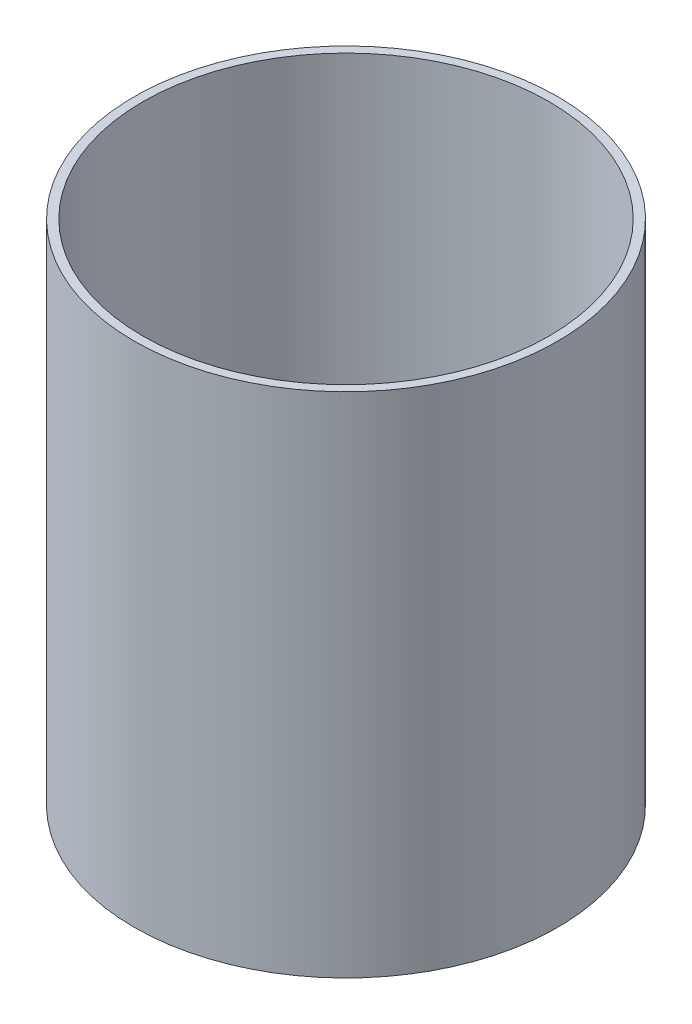
ISO-10303-21;
HEADER;
FILE_DESCRIPTION(('STEP AP214'),'2;1');
FILE_NAME('part.step','',(''),(''),'','','');
FILE_SCHEMA(('AUTOMOTIVE_DESIGN { 1 0 10303 214 1 1 1 1 }'));
ENDSEC;
DATA;
#1=APPLICATION_CONTEXT('core data for automotive mechanical design processes');
#2=APPLICATION_PROTOCOL_DEFINITION('international standard','automotive_design',2000,#1);
#3=PRODUCT_CONTEXT('',#1,'mechanical');
#4=PRODUCT('Part','Part','',(#3));
#5=PRODUCT_RELATED_PRODUCT_CATEGORY('part','',(#4));
#6=PRODUCT_DEFINITION_FORMATION('','',#4);
#7=PRODUCT_DEFINITION_CONTEXT('part definition',#1,'design');
#8=PRODUCT_DEFINITION('design','',#6,#7);
#9=PRODUCT_DEFINITION_SHAPE('','',#8);
#10=(LENGTH_UNIT() NAMED_UNIT(*) SI_UNIT(.MILLI.,.METRE.));
#11=(NAMED_UNIT(*) PLANE_ANGLE_UNIT() SI_UNIT($,.RADIAN.));
#12=(NAMED_UNIT(*) SI_UNIT($,.STERADIAN.) SOLID_ANGLE_UNIT());
#13=UNCERTAINTY_MEASURE_WITH_UNIT(LENGTH_MEASURE(1.E-05),#10,'distance_accuracy_value','');
#14=(GEOMETRIC_REPRESENTATION_CONTEXT(3) GLOBAL_UNCERTAINTY_ASSIGNED_CONTEXT((#13)) GLOBAL_UNIT_ASSIGNED_CONTEXT((#10,
#11,#12)) REPRESENTATION_CONTEXT('',''));
#15=CARTESIAN_POINT('',(0.,0.,0.));
#16=DIRECTION('',(0.,0.,1.));
#17=DIRECTION('',(1.,0.,0.));
#18=AXIS2_PLACEMENT_3D('',#15,#16,#17);
#19=CARTESIAN_POINT('',(-29.3915702540631,58.5,-2.61136815391197));
#20=DIRECTION('',(0.,1.,0.));
#21=DIRECTION('',(0.,0.,1.));
#22=AXIS2_PLACEMENT_3D('',#19,#20,#21);
#23=PLANE('',#22);
#24=CARTESIAN_POINT('',(-29.3915702540631,58.5,-2.61136815391197));
#25=DIRECTION('',(0.,1.,0.));
#26=DIRECTION('',(0.,0.,1.));
#27=AXIS2_PLACEMENT_3D('',#24,#25,#26);
#28=CIRCLE('',#27,24.401);
#29=CARTESIAN_POINT('',(-29.3915702540631,58.5,-27.012368153912));
#30=VERTEX_POINT('',#29);
#31=EDGE_CURVE('E10',#30,#30,#28,.T.);
#32=ORIENTED_EDGE('',*,*,#31,.T.);
#33=EDGE_LOOP('',(#32));
#34=FACE_BOUND('',#33,.T.);
#35=CARTESIAN_POINT('',(-29.3915702540631,58.5,-2.61136815391197));
#36=DIRECTION('',(0.,1.,0.));
#37=DIRECTION('',(0.,0.,1.));
#38=AXIS2_PLACEMENT_3D('',#35,#36,#37);
#39=CIRCLE('',#38,23.401);
#40=CARTESIAN_POINT('',(-29.3915702540631,58.5,-26.012368153912));
#41=VERTEX_POINT('',#40);
#42=EDGE_CURVE('E46',#41,#41,#39,.T.);
#43=ORIENTED_EDGE('',*,*,#42,.F.);
#44=EDGE_LOOP('',(#43));
#45=FACE_BOUND('',#44,.T.);
#46=ADVANCED_FACE('F35',(#34,#45),#23,.T.);
#47=CARTESIAN_POINT('',(-29.3915702540631,0.,-2.61136815391197));
#48=DIRECTION('',(0.,1.,0.));
#49=DIRECTION('',(0.,0.,1.));
#50=AXIS2_PLACEMENT_3D('',#47,#48,#49);
#51=PLANE('',#50);
#52=CARTESIAN_POINT('',(-29.3915702540631,0.,-2.61136815391197));
#53=DIRECTION('',(0.,1.,0.));
#54=DIRECTION('',(0.,0.,1.));
#55=AXIS2_PLACEMENT_3D('',#52,#53,#54);
#56=CIRCLE('',#55,24.401);
#57=CARTESIAN_POINT('',(-29.3915702540631,0.,-27.012368153912));
#58=VERTEX_POINT('',#57);
#59=EDGE_CURVE('E39',#58,#58,#56,.T.);
#60=ORIENTED_EDGE('',*,*,#59,.F.);
#61=EDGE_LOOP('',(#60));
#62=FACE_BOUND('',#61,.T.);
#63=CARTESIAN_POINT('',(-29.3915702540631,0.,-2.61136815391197));
#64=DIRECTION('',(0.,1.,0.));
#65=DIRECTION('',(0.,0.,1.));
#66=AXIS2_PLACEMENT_3D('',#63,#64,#65);
#67=CIRCLE('',#66,23.401);
#68=CARTESIAN_POINT('',(-29.3915702540631,0.,-26.012368153912));
#69=VERTEX_POINT('',#68);
#70=EDGE_CURVE('E48',#69,#69,#67,.T.);
#71=ORIENTED_EDGE('',*,*,#70,.T.);
#72=EDGE_LOOP('',(#71));
#73=FACE_BOUND('',#72,.T.);
#74=ADVANCED_FACE('F58',(#62,#73),#51,.F.);
#75=CARTESIAN_POINT('',(-29.3915702540631,58.5,-2.61136815391197));
#76=DIRECTION('',(0.,-1.,0.));
#77=DIRECTION('',(0.,0.,-1.));
#78=AXIS2_PLACEMENT_3D('',#75,#76,#77);
#79=CYLINDRICAL_SURFACE('',#78,24.401);
#80=CARTESIAN_POINT('',(-29.3915702540631,58.5,-27.012368153912));
#81=CARTESIAN_POINT('',(-29.3915702540631,57.890625,-27.012368153912));
#82=CARTESIAN_POINT('',(-29.3915702540631,57.28125,-27.012368153912));
#83=CARTESIAN_POINT('',(-29.3915702540631,56.0625,-27.012368153912));
#84=CARTESIAN_POINT('',(-29.3915702540631,55.453125,-27.012368153912));
#85=CARTESIAN_POINT('',(-29.3915702540631,54.234375,-27.012368153912));
#86=CARTESIAN_POINT('',(-29.3915702540631,53.625,-27.012368153912));
#87=CARTESIAN_POINT('',(-29.3915702540631,52.40625,-27.012368153912));
#88=CARTESIAN_POINT('',(-29.3915702540631,51.796875,-27.012368153912));
#89=CARTESIAN_POINT('',(-29.3915702540631,50.578125,-27.012368153912));
#90=CARTESIAN_POINT('',(-29.3915702540631,49.96875,-27.012368153912));
#91=CARTESIAN_POINT('',(-29.3915702540631,48.75,-27.012368153912));
#92=CARTESIAN_POINT('',(-29.3915702540631,48.140625,-27.012368153912));
#93=CARTESIAN_POINT('',(-29.3915702540631,46.921875,-27.012368153912));
#94=CARTESIAN_POINT('',(-29.3915702540631,46.3125,-27.012368153912));
#95=CARTESIAN_POINT('',(-29.3915702540631,45.09375,-27.012368153912));
#96=CARTESIAN_POINT('',(-29.3915702540631,44.484375,-27.012368153912));
#97=CARTESIAN_POINT('',(-29.3915702540631,43.265625,-27.012368153912));
#98=CARTESIAN_POINT('',(-29.3915702540631,42.65625,-27.012368153912));
#99=CARTESIAN_POINT('',(-29.3915702540631,41.4375,-27.012368153912));
#100=CARTESIAN_POINT('',(-29.3915702540631,40.828125,-27.012368153912));
#101=CARTESIAN_POINT('',(-29.3915702540631,39.609375,-27.012368153912));
#102=CARTESIAN_POINT('',(-29.3915702540631,39.,-27.012368153912));
#103=CARTESIAN_POINT('',(-29.3915702540631,37.78125,-27.012368153912));
#104=CARTESIAN_POINT('',(-29.3915702540631,37.171875,-27.012368153912));
#105=CARTESIAN_POINT('',(-29.3915702540631,35.953125,-27.012368153912));
#106=CARTESIAN_POINT('',(-29.3915702540631,35.34375,-27.012368153912));
#107=CARTESIAN_POINT('',(-29.3915702540631,34.125,-27.012368153912));
#108=CARTESIAN_POINT('',(-29.3915702540631,33.515625,-27.012368153912));
#109=CARTESIAN_POINT('',(-29.3915702540631,32.296875,-27.012368153912));
#110=CARTESIAN_POINT('',(-29.3915702540631,31.6875,-27.012368153912));
#111=CARTESIAN_POINT('',(-29.3915702540631,30.46875,-27.012368153912));
#112=CARTESIAN_POINT('',(-29.3915702540631,29.859375,-27.012368153912));
#113=CARTESIAN_POINT('',(-29.3915702540631,28.640625,-27.012368153912));
#114=CARTESIAN_POINT('',(-29.3915702540631,28.03125,-27.012368153912));
#115=CARTESIAN_POINT('',(-29.3915702540631,26.8125,-27.012368153912));
#116=CARTESIAN_POINT('',(-29.3915702540631,26.203125,-27.012368153912));
#117=CARTESIAN_POINT('',(-29.3915702540631,24.984375,-27.012368153912));
#118=CARTESIAN_POINT('',(-29.3915702540631,24.375,-27.012368153912));
#119=CARTESIAN_POINT('',(-29.3915702540631,23.15625,-27.012368153912));
#120=CARTESIAN_POINT('',(-29.3915702540631,22.546875,-27.012368153912));
#121=CARTESIAN_POINT('',(-29.3915702540631,21.328125,-27.012368153912));
#122=CARTESIAN_POINT('',(-29.3915702540631,20.71875,-27.012368153912));
#123=CARTESIAN_POINT('',(-29.3915702540631,19.5,-27.012368153912));
#124=CARTESIAN_POINT('',(-29.3915702540631,18.890625,-27.012368153912));
#125=CARTESIAN_POINT('',(-29.3915702540631,17.671875,-27.012368153912));
#126=CARTESIAN_POINT('',(-29.3915702540631,17.0625,-27.012368153912));
#127=CARTESIAN_POINT('',(-29.3915702540631,15.84375,-27.012368153912));
#128=CARTESIAN_POINT('',(-29.3915702540631,15.234375,-27.012368153912));
#129=CARTESIAN_POINT('',(-29.3915702540631,14.015625,-27.012368153912));
#130=CARTESIAN_POINT('',(-29.3915702540631,13.40625,-27.012368153912));
#131=CARTESIAN_POINT('',(-29.3915702540631,12.1875,-27.012368153912));
#132=CARTESIAN_POINT('',(-29.3915702540631,11.578125,-27.012368153912));
#133=CARTESIAN_POINT('',(-29.3915702540631,10.359375,-27.012368153912));
#134=CARTESIAN_POINT('',(-29.3915702540631,9.74999999999999,-27.012368153912));
#135=CARTESIAN_POINT('',(-29.3915702540631,8.53124999999999,-27.012368153912));
#136=CARTESIAN_POINT('',(-29.3915702540631,7.92187499999999,-27.012368153912));
#137=CARTESIAN_POINT('',(-29.3915702540631,6.70312499999999,-27.012368153912));
#138=CARTESIAN_POINT('',(-29.3915702540631,6.09374999999999,-27.012368153912));
#139=CARTESIAN_POINT('',(-29.3915702540631,4.87499999999999,-27.012368153912));
#140=CARTESIAN_POINT('',(-29.3915702540631,4.26562499999999,-27.012368153912));
#141=CARTESIAN_POINT('',(-29.3915702540631,3.04687499999999,-27.012368153912));
#142=CARTESIAN_POINT('',(-29.3915702540631,2.43749999999999,-27.012368153912));
#143=CARTESIAN_POINT('',(-29.3915702540631,1.21874999999999,-27.012368153912));
#144=CARTESIAN_POINT('',(-29.3915702540631,0.609374999999993,-27.012368153912));
#145=CARTESIAN_POINT('',(-29.3915702540631,0.,-27.012368153912));
#146=B_SPLINE_CURVE_WITH_KNOTS('',3,(#80,#81,#82,#83,#84,#85,#86,#87,#88,#89,#90,#91,#92,#93,
#94,#95,#96,#97,#98,#99,#100,#101,#102,#103,#104,#105,#106,#107,#108,#109,#110,#111,#112,#113,
#114,#115,#116,#117,#118,#119,#120,#121,#122,#123,#124,#125,#126,#127,#128,#129,#130,#131,#132,
#133,#134,#135,#136,#137,#138,#139,#140,#141,#142,#143,#144,#145),.UNSPECIFIED.,.F.,.F.,(4,2,2,
2,2,2,2,2,2,2,2,2,2,2,2,2,2,2,2,2,2,2,2,2,2,2,2,2,2,2,2,2,4),(0.,1.82812499999999,
3.65624999999999,5.48437499999999,7.31249999999999,9.14062499999999,10.96875,12.796875,14.625,
16.453125,18.28125,20.109375,21.9375,23.765625,25.59375,27.421875,29.25,31.078125,32.90625,
34.734375,36.5625,38.390625,40.21875,42.046875,43.875,45.703125,47.53125,49.359375,51.1875,
53.015625,54.84375,56.671875,58.5),.UNSPECIFIED.);
#147=EDGE_CURVE('BSEAM37',#30,#58,#146,.T.);
#148=ORIENTED_EDGE('',*,*,#31,.F.);
#149=ORIENTED_EDGE('',*,*,#59,.T.);
#150=ORIENTED_EDGE('',*,*,#147,.T.);
#151=ORIENTED_EDGE('',*,*,#147,.F.);
#152=EDGE_LOOP('',(#148,#150,#149,#151));
#153=FACE_BOUND('',#152,.T.);
#154=ADVANCED_FACE('F37',(#153),#79,.T.);
#155=CARTESIAN_POINT('',(-29.3915702540631,58.5,-2.61136815391197));
#156=DIRECTION('',(0.,-1.,0.));
#157=DIRECTION('',(0.,0.,-1.));
#158=AXIS2_PLACEMENT_3D('',#155,#156,#157);
#159=CYLINDRICAL_SURFACE('',#158,23.401);
#160=CARTESIAN_POINT('',(-29.3915702540631,58.5,-26.012368153912));
#161=CARTESIAN_POINT('',(-29.3915702540631,57.890625,-26.012368153912));
#162=CARTESIAN_POINT('',(-29.3915702540631,57.28125,-26.012368153912));
#163=CARTESIAN_POINT('',(-29.3915702540631,56.0625,-26.012368153912));
#164=CARTESIAN_POINT('',(-29.3915702540631,55.453125,-26.012368153912));
#165=CARTESIAN_POINT('',(-29.3915702540631,54.234375,-26.012368153912));
#166=CARTESIAN_POINT('',(-29.3915702540631,53.625,-26.012368153912));
#167=CARTESIAN_POINT('',(-29.3915702540631,52.40625,-26.012368153912));
#168=CARTESIAN_POINT('',(-29.3915702540631,51.796875,-26.012368153912));
#169=CARTESIAN_POINT('',(-29.3915702540631,50.578125,-26.012368153912));
#170=CARTESIAN_POINT('',(-29.3915702540631,49.96875,-26.012368153912));
#171=CARTESIAN_POINT('',(-29.3915702540631,48.75,-26.012368153912));
#172=CARTESIAN_POINT('',(-29.3915702540631,48.140625,-26.012368153912));
#173=CARTESIAN_POINT('',(-29.3915702540631,46.921875,-26.012368153912));
#174=CARTESIAN_POINT('',(-29.3915702540631,46.3125,-26.012368153912));
#175=CARTESIAN_POINT('',(-29.3915702540631,45.09375,-26.012368153912));
#176=CARTESIAN_POINT('',(-29.3915702540631,44.484375,-26.012368153912));
#177=CARTESIAN_POINT('',(-29.3915702540631,43.265625,-26.012368153912));
#178=CARTESIAN_POINT('',(-29.3915702540631,42.65625,-26.012368153912));
#179=CARTESIAN_POINT('',(-29.3915702540631,41.4375,-26.012368153912));
#180=CARTESIAN_POINT('',(-29.3915702540631,40.828125,-26.012368153912));
#181=CARTESIAN_POINT('',(-29.3915702540631,39.609375,-26.012368153912));
#182=CARTESIAN_POINT('',(-29.3915702540631,39.,-26.012368153912));
#183=CARTESIAN_POINT('',(-29.3915702540631,37.78125,-26.012368153912));
#184=CARTESIAN_POINT('',(-29.3915702540631,37.171875,-26.012368153912));
#185=CARTESIAN_POINT('',(-29.3915702540631,35.953125,-26.012368153912));
#186=CARTESIAN_POINT('',(-29.3915702540631,35.34375,-26.012368153912));
#187=CARTESIAN_POINT('',(-29.3915702540631,34.125,-26.012368153912));
#188=CARTESIAN_POINT('',(-29.3915702540631,33.515625,-26.012368153912));
#189=CARTESIAN_POINT('',(-29.3915702540631,32.296875,-26.012368153912));
#190=CARTESIAN_POINT('',(-29.3915702540631,31.6875,-26.012368153912));
#191=CARTESIAN_POINT('',(-29.3915702540631,30.46875,-26.012368153912));
#192=CARTESIAN_POINT('',(-29.3915702540631,29.859375,-26.012368153912));
#193=CARTESIAN_POINT('',(-29.3915702540631,28.640625,-26.012368153912));
#194=CARTESIAN_POINT('',(-29.3915702540631,28.03125,-26.012368153912));
#195=CARTESIAN_POINT('',(-29.3915702540631,26.8125,-26.012368153912));
#196=CARTESIAN_POINT('',(-29.3915702540631,26.203125,-26.012368153912));
#197=CARTESIAN_POINT('',(-29.3915702540631,24.984375,-26.012368153912));
#198=CARTESIAN_POINT('',(-29.3915702540631,24.375,-26.012368153912));
#199=CARTESIAN_POINT('',(-29.3915702540631,23.15625,-26.012368153912));
#200=CARTESIAN_POINT('',(-29.3915702540631,22.546875,-26.012368153912));
#201=CARTESIAN_POINT('',(-29.3915702540631,21.328125,-26.012368153912));
#202=CARTESIAN_POINT('',(-29.3915702540631,20.71875,-26.012368153912));
#203=CARTESIAN_POINT('',(-29.3915702540631,19.5,-26.012368153912));
#204=CARTESIAN_POINT('',(-29.3915702540631,18.890625,-26.012368153912));
#205=CARTESIAN_POINT('',(-29.3915702540631,17.671875,-26.012368153912));
#206=CARTESIAN_POINT('',(-29.3915702540631,17.0625,-26.012368153912));
#207=CARTESIAN_POINT('',(-29.3915702540631,15.84375,-26.012368153912));
#208=CARTESIAN_POINT('',(-29.3915702540631,15.234375,-26.012368153912));
#209=CARTESIAN_POINT('',(-29.3915702540631,14.015625,-26.012368153912));
#210=CARTESIAN_POINT('',(-29.3915702540631,13.40625,-26.012368153912));
#211=CARTESIAN_POINT('',(-29.3915702540631,12.1875,-26.012368153912));
#212=CARTESIAN_POINT('',(-29.3915702540631,11.578125,-26.012368153912));
#213=CARTESIAN_POINT('',(-29.3915702540631,10.359375,-26.012368153912));
#214=CARTESIAN_POINT('',(-29.3915702540631,9.74999999999999,-26.012368153912));
#215=CARTESIAN_POINT('',(-29.3915702540631,8.53124999999999,-26.012368153912));
#216=CARTESIAN_POINT('',(-29.3915702540631,7.92187499999999,-26.012368153912));
#217=CARTESIAN_POINT('',(-29.3915702540631,6.70312499999999,-26.012368153912));
#218=CARTESIAN_POINT('',(-29.3915702540631,6.09374999999999,-26.012368153912));
#219=CARTESIAN_POINT('',(-29.3915702540631,4.87499999999999,-26.012368153912));
#220=CARTESIAN_POINT('',(-29.3915702540631,4.26562499999999,-26.012368153912));
#221=CARTESIAN_POINT('',(-29.3915702540631,3.04687499999999,-26.012368153912));
#222=CARTESIAN_POINT('',(-29.3915702540631,2.43749999999999,-26.012368153912));
#223=CARTESIAN_POINT('',(-29.3915702540631,1.21874999999999,-26.012368153912));
#224=CARTESIAN_POINT('',(-29.3915702540631,0.609374999999993,-26.012368153912));
#225=CARTESIAN_POINT('',(-29.3915702540631,0.,-26.012368153912));
#226=B_SPLINE_CURVE_WITH_KNOTS('',3,(#160,#161,#162,#163,#164,#165,#166,#167,#168,#169,#170,
#171,#172,#173,#174,#175,#176,#177,#178,#179,#180,#181,#182,#183,#184,#185,#186,#187,#188,#189,
#190,#191,#192,#193,#194,#195,#196,#197,#198,#199,#200,#201,#202,#203,#204,#205,#206,#207,#208,
#209,#210,#211,#212,#213,#214,#215,#216,#217,#218,#219,#220,#221,#222,#223,#224,#225),
.UNSPECIFIED.,.F.,.F.,(4,2,2,2,2,2,2,2,2,2,2,2,2,2,2,2,2,2,2,2,2,2,2,2,2,2,2,2,2,2,2,2,4),(0.,
1.82812500000001,3.65625000000001,5.48437500000001,7.31250000000001,9.140625,10.96875,12.796875,
14.625,16.453125,18.28125,20.109375,21.9375,23.765625,25.59375,27.421875,29.25,31.078125,
32.90625,34.734375,36.5625,38.390625,40.21875,42.046875,43.875,45.703125,47.53125,49.359375,
51.1875,53.015625,54.84375,56.671875,58.5),.UNSPECIFIED.);
#227=EDGE_CURVE('BSEAM54',#41,#69,#226,.T.);
#228=ORIENTED_EDGE('',*,*,#42,.T.);
#229=ORIENTED_EDGE('',*,*,#70,.F.);
#230=ORIENTED_EDGE('',*,*,#227,.T.);
#231=ORIENTED_EDGE('',*,*,#227,.F.);
#232=EDGE_LOOP('',(#228,#230,#229,#231));
#233=FACE_BOUND('',#232,.T.);
#234=ADVANCED_FACE('F54',(#233),#159,.F.);
#235=CLOSED_SHELL('',(#46,#74,#154,#234));
#236=MANIFOLD_SOLID_BREP('B2',#235);
#237=ADVANCED_BREP_SHAPE_REPRESENTATION('',(#18,#236),#14);
#238=SHAPE_DEFINITION_REPRESENTATION(#9,#237);
ENDSEC;
END-ISO-10303-21;
